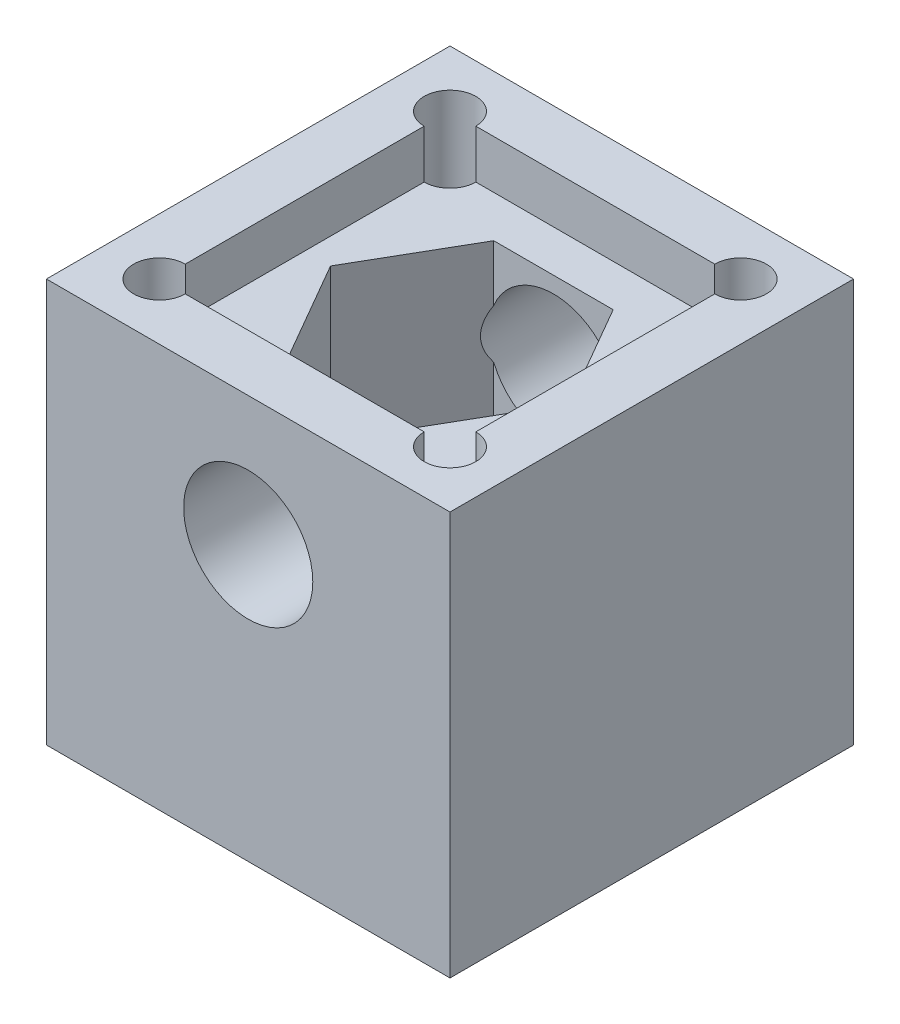
ISO-10303-21;
HEADER;
FILE_DESCRIPTION(('STEP AP214'),'2;1');
FILE_NAME('part.step','',(''),(''),'','','');
FILE_SCHEMA(('AUTOMOTIVE_DESIGN { 1 0 10303 214 1 1 1 1 }'));
ENDSEC;
DATA;
#1=APPLICATION_CONTEXT('core data for automotive mechanical design processes');
#2=APPLICATION_PROTOCOL_DEFINITION('international standard','automotive_design',2000,#1);
#3=PRODUCT_CONTEXT('',#1,'mechanical');
#4=PRODUCT('Part','Part','',(#3));
#5=PRODUCT_RELATED_PRODUCT_CATEGORY('part','',(#4));
#6=PRODUCT_DEFINITION_FORMATION('','',#4);
#7=PRODUCT_DEFINITION_CONTEXT('part definition',#1,'design');
#8=PRODUCT_DEFINITION('design','',#6,#7);
#9=PRODUCT_DEFINITION_SHAPE('','',#8);
#10=(LENGTH_UNIT() NAMED_UNIT(*) SI_UNIT(.MILLI.,.METRE.));
#11=(NAMED_UNIT(*) PLANE_ANGLE_UNIT() SI_UNIT($,.RADIAN.));
#12=(NAMED_UNIT(*) SI_UNIT($,.STERADIAN.) SOLID_ANGLE_UNIT());
#13=UNCERTAINTY_MEASURE_WITH_UNIT(LENGTH_MEASURE(1.E-05),#10,'distance_accuracy_value','');
#14=(GEOMETRIC_REPRESENTATION_CONTEXT(3) GLOBAL_UNCERTAINTY_ASSIGNED_CONTEXT((#13)) GLOBAL_UNIT_ASSIGNED_CONTEXT((#10,
#11,#12)) REPRESENTATION_CONTEXT('',''));
#15=CARTESIAN_POINT('',(0.,0.,0.));
#16=DIRECTION('',(0.,0.,1.));
#17=DIRECTION('',(1.,0.,0.));
#18=AXIS2_PLACEMENT_3D('',#15,#16,#17);
#19=CARTESIAN_POINT('',(-3.7,7.,-6.40858798800484));
#20=DIRECTION('',(-0.866025403784439,0.,-0.5));
#21=DIRECTION('',(-0.5,0.,0.866025403784439));
#22=AXIS2_PLACEMENT_3D('',#19,#20,#21);
#23=PLANE('',#22);
#24=DIRECTION('',(0.5,0.,-0.866025403784439));
#25=VECTOR('',#24,1.);
#26=CARTESIAN_POINT('',(-3.7,22.,-6.40858798800484));
#27=LINE('',#26,#25);
#28=CARTESIAN_POINT('',(-7.4,22.,0.));
#29=VERTEX_POINT('',#28);
#30=CARTESIAN_POINT('',(-3.7,22.,-6.40858798800484));
#31=VERTEX_POINT('',#30);
#32=EDGE_CURVE('E384',#29,#31,#27,.T.);
#33=ORIENTED_EDGE('',*,*,#32,.F.);
#34=DIRECTION('',(0.,1.,0.));
#35=VECTOR('',#34,1.);
#36=CARTESIAN_POINT('',(-7.4,7.,0.));
#37=LINE('',#36,#35);
#38=CARTESIAN_POINT('',(-7.4,7.,0.));
#39=VERTEX_POINT('',#38);
#40=EDGE_CURVE('E239',#39,#29,#37,.T.);
#41=ORIENTED_EDGE('',*,*,#40,.F.);
#42=DIRECTION('',(-0.5,0.,0.866025403784439));
#43=VECTOR('',#42,1.);
#44=CARTESIAN_POINT('',(-3.7,7.,-6.40858798800484));
#45=LINE('',#44,#43);
#46=CARTESIAN_POINT('',(-3.7,7.,-6.40858798800484));
#47=VERTEX_POINT('',#46);
#48=EDGE_CURVE('E235',#47,#39,#45,.T.);
#49=ORIENTED_EDGE('',*,*,#48,.F.);
#50=DIRECTION('',(0.,1.,0.));
#51=VECTOR('',#50,1.);
#52=CARTESIAN_POINT('',(-3.7,7.,-6.40858798800484));
#53=LINE('',#52,#51);
#54=CARTESIAN_POINT('',(-3.7,15.4801315846429,-6.40858798800484));
#55=VERTEX_POINT('',#54);
#56=EDGE_CURVE('E243',#47,#55,#53,.T.);
#57=ORIENTED_EDGE('',*,*,#56,.T.);
#58=CARTESIAN_POINT('',(0.,17.,-12.8171759760097));
#59=DIRECTION('',(-0.866025403784439,0.,-0.5));
#60=DIRECTION('',(-0.5,0.,0.866025403784439));
#61=AXIS2_PLACEMENT_3D('',#58,#59,#60);
#62=ELLIPSE('',#61,8.,4.);
#63=CARTESIAN_POINT('',(-3.7,18.5198684153571,-6.40858798800484));
#64=VERTEX_POINT('',#63);
#65=EDGE_CURVE('E268',#64,#55,#62,.F.);
#66=ORIENTED_EDGE('',*,*,#65,.F.);
#67=EDGE_CURVE('E246',#64,#31,#53,.T.);
#68=ORIENTED_EDGE('',*,*,#67,.T.);
#69=EDGE_LOOP('',(#33,#41,#49,#57,#66,#68));
#70=FACE_BOUND('',#69,.T.);
#71=ADVANCED_FACE('F34',(#70),#23,.F.);
#72=CARTESIAN_POINT('',(3.7,7.,-6.40858798800485));
#73=DIRECTION('',(0.,0.,-1.));
#74=DIRECTION('',(-1.,0.,0.));
#75=AXIS2_PLACEMENT_3D('',#72,#73,#74);
#76=PLANE('',#75);
#77=DIRECTION('',(1.,0.,0.));
#78=VECTOR('',#77,1.);
#79=CARTESIAN_POINT('',(3.7,22.,-6.40858798800485));
#80=LINE('',#79,#78);
#81=CARTESIAN_POINT('',(3.7,22.,-6.40858798800484));
#82=VERTEX_POINT('',#81);
#83=EDGE_CURVE('E382',#31,#82,#80,.T.);
#84=ORIENTED_EDGE('',*,*,#83,.F.);
#85=ORIENTED_EDGE('',*,*,#67,.F.);
#86=CARTESIAN_POINT('',(0.,17.,-6.40858798800485));
#87=DIRECTION('',(0.,0.,-1.));
#88=DIRECTION('',(-1.,0.,0.));
#89=AXIS2_PLACEMENT_3D('',#86,#87,#88);
#90=CIRCLE('',#89,4.);
#91=CARTESIAN_POINT('',(3.7,18.5198684153571,-6.40858798800485));
#92=VERTEX_POINT('',#91);
#93=EDGE_CURVE('E264',#92,#64,#90,.F.);
#94=ORIENTED_EDGE('',*,*,#93,.F.);
#95=DIRECTION('',(0.,1.,0.));
#96=VECTOR('',#95,1.);
#97=CARTESIAN_POINT('',(3.7,7.,-6.40858798800485));
#98=LINE('',#97,#96);
#99=EDGE_CURVE('E250',#92,#82,#98,.T.);
#100=ORIENTED_EDGE('',*,*,#99,.T.);
#101=EDGE_LOOP('',(#84,#85,#94,#100));
#102=FACE_BOUND('',#101,.T.);
#103=ADVANCED_FACE('F410',(#102),#76,.F.);
#104=CARTESIAN_POINT('',(7.4,7.,0.));
#105=DIRECTION('',(0.866025403784438,0.,-0.5));
#106=DIRECTION('',(-0.5,0.,-0.866025403784439));
#107=AXIS2_PLACEMENT_3D('',#104,#105,#106);
#108=PLANE('',#107);
#109=DIRECTION('',(0.5,0.,0.866025403784439));
#110=VECTOR('',#109,1.);
#111=CARTESIAN_POINT('',(7.4,22.,0.));
#112=LINE('',#111,#110);
#113=CARTESIAN_POINT('',(7.4,22.,0.));
#114=VERTEX_POINT('',#113);
#115=EDGE_CURVE('E380',#82,#114,#112,.T.);
#116=ORIENTED_EDGE('',*,*,#115,.F.);
#117=ORIENTED_EDGE('',*,*,#99,.F.);
#118=CARTESIAN_POINT('',(0.,17.,-12.8171759760097));
#119=DIRECTION('',(0.866025403784438,0.,-0.5));
#120=DIRECTION('',(0.5,0.,0.866025403784439));
#121=AXIS2_PLACEMENT_3D('',#118,#119,#120);
#122=ELLIPSE('',#121,8.,4.);
#123=CARTESIAN_POINT('',(3.7,15.4801315846429,-6.40858798800485));
#124=VERTEX_POINT('',#123);
#125=EDGE_CURVE('E261',#124,#92,#122,.F.);
#126=ORIENTED_EDGE('',*,*,#125,.F.);
#127=CARTESIAN_POINT('',(3.7,7.,-6.40858798800485));
#128=VERTEX_POINT('',#127);
#129=EDGE_CURVE('E247',#128,#124,#98,.T.);
#130=ORIENTED_EDGE('',*,*,#129,.F.);
#131=DIRECTION('',(-0.5,0.,-0.866025403784439));
#132=VECTOR('',#131,1.);
#133=CARTESIAN_POINT('',(7.4,7.,0.));
#134=LINE('',#133,#132);
#135=CARTESIAN_POINT('',(7.4,7.,0.));
#136=VERTEX_POINT('',#135);
#137=EDGE_CURVE('E229',#136,#128,#134,.T.);
#138=ORIENTED_EDGE('',*,*,#137,.F.);
#139=DIRECTION('',(0.,1.,0.));
#140=VECTOR('',#139,1.);
#141=CARTESIAN_POINT('',(7.4,7.,0.));
#142=LINE('',#141,#140);
#143=EDGE_CURVE('E251',#136,#114,#142,.T.);
#144=ORIENTED_EDGE('',*,*,#143,.T.);
#145=EDGE_LOOP('',(#116,#117,#126,#130,#138,#144));
#146=FACE_BOUND('',#145,.T.);
#147=ADVANCED_FACE('F416',(#146),#108,.F.);
#148=CARTESIAN_POINT('',(-7.4,7.,0.));
#149=DIRECTION('',(-0.866025403784438,0.,0.5));
#150=DIRECTION('',(0.5,0.,0.866025403784439));
#151=AXIS2_PLACEMENT_3D('',#148,#149,#150);
#152=PLANE('',#151);
#153=DIRECTION('',(-0.5,0.,-0.866025403784439));
#154=VECTOR('',#153,1.);
#155=CARTESIAN_POINT('',(-7.4,22.,0.));
#156=LINE('',#155,#154);
#157=CARTESIAN_POINT('',(-3.7,22.,6.40858798800485));
#158=VERTEX_POINT('',#157);
#159=EDGE_CURVE('E378',#158,#29,#156,.T.);
#160=ORIENTED_EDGE('',*,*,#159,.F.);
#161=DIRECTION('',(0.,1.,0.));
#162=VECTOR('',#161,1.);
#163=CARTESIAN_POINT('',(-3.7,7.,6.40858798800485));
#164=LINE('',#163,#162);
#165=CARTESIAN_POINT('',(-3.7,18.5198684153571,6.40858798800485));
#166=VERTEX_POINT('',#165);
#167=EDGE_CURVE('E238',#166,#158,#164,.T.);
#168=ORIENTED_EDGE('',*,*,#167,.F.);
#169=CARTESIAN_POINT('',(0.,17.,12.8171759760097));
#170=DIRECTION('',(-0.866025403784438,0.,0.5));
#171=DIRECTION('',(0.5,0.,0.866025403784439));
#172=AXIS2_PLACEMENT_3D('',#169,#170,#171);
#173=ELLIPSE('',#172,8.,4.);
#174=CARTESIAN_POINT('',(-3.7,15.4801315846429,6.40858798800485));
#175=VERTEX_POINT('',#174);
#176=EDGE_CURVE('E319',#175,#166,#173,.F.);
#177=ORIENTED_EDGE('',*,*,#176,.F.);
#178=CARTESIAN_POINT('',(-3.7,7.,6.40858798800485));
#179=VERTEX_POINT('',#178);
#180=EDGE_CURVE('E258',#179,#175,#164,.T.);
#181=ORIENTED_EDGE('',*,*,#180,.F.);
#182=DIRECTION('',(0.5,0.,0.866025403784439));
#183=VECTOR('',#182,1.);
#184=CARTESIAN_POINT('',(-7.4,7.,0.));
#185=LINE('',#184,#183);
#186=EDGE_CURVE('E214',#39,#179,#185,.T.);
#187=ORIENTED_EDGE('',*,*,#186,.F.);
#188=ORIENTED_EDGE('',*,*,#40,.T.);
#189=EDGE_LOOP('',(#160,#168,#177,#181,#187,#188));
#190=FACE_BOUND('',#189,.T.);
#191=ADVANCED_FACE('F431',(#190),#152,.F.);
#192=CARTESIAN_POINT('',(3.7,7.,6.40858798800485));
#193=DIRECTION('',(0.866025403784439,0.,0.5));
#194=DIRECTION('',(0.5,0.,-0.866025403784439));
#195=AXIS2_PLACEMENT_3D('',#192,#193,#194);
#196=PLANE('',#195);
#197=DIRECTION('',(-0.5,0.,0.866025403784439));
#198=VECTOR('',#197,1.);
#199=CARTESIAN_POINT('',(3.7,22.,6.40858798800485));
#200=LINE('',#199,#198);
#201=CARTESIAN_POINT('',(3.7,22.,6.40858798800485));
#202=VERTEX_POINT('',#201);
#203=EDGE_CURVE('E49',#114,#202,#200,.T.);
#204=ORIENTED_EDGE('',*,*,#203,.F.);
#205=ORIENTED_EDGE('',*,*,#143,.F.);
#206=DIRECTION('',(0.5,0.,-0.866025403784439));
#207=VECTOR('',#206,1.);
#208=CARTESIAN_POINT('',(3.7,7.,6.40858798800485));
#209=LINE('',#208,#207);
#210=CARTESIAN_POINT('',(3.7,7.,6.40858798800485));
#211=VERTEX_POINT('',#210);
#212=EDGE_CURVE('E226',#211,#136,#209,.T.);
#213=ORIENTED_EDGE('',*,*,#212,.F.);
#214=DIRECTION('',(0.,1.,0.));
#215=VECTOR('',#214,1.);
#216=CARTESIAN_POINT('',(3.7,7.,6.40858798800485));
#217=LINE('',#216,#215);
#218=CARTESIAN_POINT('',(3.7,15.4801315846429,6.40858798800485));
#219=VERTEX_POINT('',#218);
#220=EDGE_CURVE('E254',#211,#219,#217,.T.);
#221=ORIENTED_EDGE('',*,*,#220,.T.);
#222=CARTESIAN_POINT('',(0.,17.,12.8171759760097));
#223=DIRECTION('',(0.866025403784439,0.,0.5));
#224=DIRECTION('',(-0.5,0.,0.866025403784439));
#225=AXIS2_PLACEMENT_3D('',#222,#223,#224);
#226=ELLIPSE('',#225,8.00000000000001,4.);
#227=CARTESIAN_POINT('',(3.7,18.5198684153571,6.40858798800485));
#228=VERTEX_POINT('',#227);
#229=EDGE_CURVE('E315',#228,#219,#226,.F.);
#230=ORIENTED_EDGE('',*,*,#229,.F.);
#231=EDGE_CURVE('E257',#228,#202,#217,.T.);
#232=ORIENTED_EDGE('',*,*,#231,.T.);
#233=EDGE_LOOP('',(#204,#205,#213,#221,#230,#232));
#234=FACE_BOUND('',#233,.T.);
#235=ADVANCED_FACE('F433',(#234),#196,.F.);
#236=CARTESIAN_POINT('',(-3.7,7.,6.40858798800485));
#237=DIRECTION('',(0.,0.,1.));
#238=DIRECTION('',(1.,0.,0.));
#239=AXIS2_PLACEMENT_3D('',#236,#237,#238);
#240=PLANE('',#239);
#241=DIRECTION('',(-1.,0.,0.));
#242=VECTOR('',#241,1.);
#243=CARTESIAN_POINT('',(-3.7,22.,6.40858798800485));
#244=LINE('',#243,#242);
#245=EDGE_CURVE('E375',#202,#158,#244,.T.);
#246=ORIENTED_EDGE('',*,*,#245,.F.);
#247=ORIENTED_EDGE('',*,*,#231,.F.);
#248=CARTESIAN_POINT('',(0.,17.,6.40858798800485));
#249=DIRECTION('',(0.,0.,1.));
#250=DIRECTION('',(1.,0.,0.));
#251=AXIS2_PLACEMENT_3D('',#248,#249,#250);
#252=CIRCLE('',#251,4.);
#253=EDGE_CURVE('E310',#166,#228,#252,.F.);
#254=ORIENTED_EDGE('',*,*,#253,.F.);
#255=ORIENTED_EDGE('',*,*,#167,.T.);
#256=EDGE_LOOP('',(#246,#247,#254,#255));
#257=FACE_BOUND('',#256,.T.);
#258=ADVANCED_FACE('F436',(#257),#240,.F.);
#259=CARTESIAN_POINT('',(0.,0.,0.));
#260=DIRECTION('',(0.,1.,0.));
#261=DIRECTION('',(0.,0.,1.));
#262=AXIS2_PLACEMENT_3D('',#259,#260,#261);
#263=CYLINDRICAL_SURFACE('',#262,4.15);
#264=CARTESIAN_POINT('',(0.,0.,0.));
#265=DIRECTION('',(0.,1.,0.));
#266=DIRECTION('',(0.,0.,1.));
#267=AXIS2_PLACEMENT_3D('',#264,#265,#266);
#268=CIRCLE('',#267,4.15);
#269=CARTESIAN_POINT('',(0.,0.,4.15));
#270=VERTEX_POINT('',#269);
#271=EDGE_CURVE('E271',#270,#270,#268,.T.);
#272=ORIENTED_EDGE('',*,*,#271,.F.);
#273=EDGE_LOOP('',(#272));
#274=FACE_BOUND('',#273,.T.);
#275=CARTESIAN_POINT('',(0.,7.,0.));
#276=DIRECTION('',(0.,1.,0.));
#277=DIRECTION('',(0.,0.,1.));
#278=AXIS2_PLACEMENT_3D('',#275,#276,#277);
#279=CIRCLE('',#278,4.15);
#280=CARTESIAN_POINT('',(0.,7.,4.15));
#281=VERTEX_POINT('',#280);
#282=EDGE_CURVE('E242',#281,#281,#279,.F.);
#283=ORIENTED_EDGE('',*,*,#282,.F.);
#284=EDGE_LOOP('',(#283));
#285=FACE_BOUND('',#284,.T.);
#286=ADVANCED_FACE('F444',(#274,#285),#263,.F.);
#287=CARTESIAN_POINT('',(0.,17.,-12.5));
#288=DIRECTION('',(0.,0.,1.));
#289=DIRECTION('',(1.,0.,0.));
#290=AXIS2_PLACEMENT_3D('',#287,#288,#289);
#291=CYLINDRICAL_SURFACE('',#290,4.);
#292=ORIENTED_EDGE('',*,*,#93,.T.);
#293=ORIENTED_EDGE('',*,*,#65,.T.);
#294=EDGE_CURVE('E267',#55,#124,#90,.F.);
#295=ORIENTED_EDGE('',*,*,#294,.T.);
#296=ORIENTED_EDGE('',*,*,#125,.T.);
#297=EDGE_LOOP('',(#292,#293,#295,#296));
#298=FACE_BOUND('',#297,.T.);
#299=CARTESIAN_POINT('',(0.,17.,-12.5));
#300=DIRECTION('',(0.,0.,1.));
#301=DIRECTION('',(1.,0.,0.));
#302=AXIS2_PLACEMENT_3D('',#299,#300,#301);
#303=CIRCLE('',#302,4.);
#304=CARTESIAN_POINT('',(4.,17.,-12.5));
#305=VERTEX_POINT('',#304);
#306=EDGE_CURVE('E275',#305,#305,#303,.T.);
#307=ORIENTED_EDGE('',*,*,#306,.F.);
#308=EDGE_LOOP('',(#307));
#309=FACE_BOUND('',#308,.T.);
#310=ADVANCED_FACE('F447',(#298,#309),#291,.F.);
#311=CARTESIAN_POINT('',(-12.5,25.,12.5));
#312=DIRECTION('',(1.,0.,0.));
#313=DIRECTION('',(0.,0.,-1.));
#314=AXIS2_PLACEMENT_3D('',#311,#312,#313);
#315=PLANE('',#314);
#316=DIRECTION('',(0.,0.,1.));
#317=VECTOR('',#316,1.);
#318=CARTESIAN_POINT('',(-12.5,0.,12.5));
#319=LINE('',#318,#317);
#320=CARTESIAN_POINT('',(-12.5,0.,-12.5));
#321=VERTEX_POINT('',#320);
#322=CARTESIAN_POINT('',(-12.5,0.,12.5));
#323=VERTEX_POINT('',#322);
#324=EDGE_CURVE('E278',#321,#323,#319,.T.);
#325=ORIENTED_EDGE('',*,*,#324,.T.);
#326=DIRECTION('',(0.,-1.,0.));
#327=VECTOR('',#326,1.);
#328=CARTESIAN_POINT('',(-12.5,25.,12.5));
#329=LINE('',#328,#327);
#330=CARTESIAN_POINT('',(-12.5,25.,12.5));
#331=VERTEX_POINT('',#330);
#332=EDGE_CURVE('E307',#331,#323,#329,.T.);
#333=ORIENTED_EDGE('',*,*,#332,.F.);
#334=DIRECTION('',(0.,0.,1.));
#335=VECTOR('',#334,1.);
#336=CARTESIAN_POINT('',(-12.5,25.,12.5));
#337=LINE('',#336,#335);
#338=CARTESIAN_POINT('',(-12.5,25.,-12.5));
#339=VERTEX_POINT('',#338);
#340=EDGE_CURVE('E281',#339,#331,#337,.T.);
#341=ORIENTED_EDGE('',*,*,#340,.F.);
#342=DIRECTION('',(0.,-1.,0.));
#343=VECTOR('',#342,1.);
#344=CARTESIAN_POINT('',(-12.5,25.,-12.5));
#345=LINE('',#344,#343);
#346=EDGE_CURVE('E291',#339,#321,#345,.T.);
#347=ORIENTED_EDGE('',*,*,#346,.T.);
#348=EDGE_LOOP('',(#325,#333,#341,#347));
#349=FACE_BOUND('',#348,.T.);
#350=ADVANCED_FACE('F36',(#349),#315,.F.);
#351=CARTESIAN_POINT('',(12.5,25.,12.5));
#352=DIRECTION('',(0.,0.,-1.));
#353=DIRECTION('',(-1.,0.,0.));
#354=AXIS2_PLACEMENT_3D('',#351,#352,#353);
#355=PLANE('',#354);
#356=CARTESIAN_POINT('',(0.,17.,12.5));
#357=DIRECTION('',(0.,0.,1.));
#358=DIRECTION('',(1.,0.,0.));
#359=AXIS2_PLACEMENT_3D('',#356,#357,#358);
#360=CIRCLE('',#359,4.);
#361=CARTESIAN_POINT('',(4.,17.,12.5));
#362=VERTEX_POINT('',#361);
#363=EDGE_CURVE('E274',#362,#362,#360,.T.);
#364=ORIENTED_EDGE('',*,*,#363,.F.);
#365=EDGE_LOOP('',(#364));
#366=FACE_BOUND('',#365,.T.);
#367=DIRECTION('',(1.,0.,0.));
#368=VECTOR('',#367,1.);
#369=CARTESIAN_POINT('',(12.5,0.,12.5));
#370=LINE('',#369,#368);
#371=CARTESIAN_POINT('',(12.5,0.,12.5));
#372=VERTEX_POINT('',#371);
#373=EDGE_CURVE('E294',#323,#372,#370,.T.);
#374=ORIENTED_EDGE('',*,*,#373,.T.);
#375=DIRECTION('',(0.,-1.,0.));
#376=VECTOR('',#375,1.);
#377=CARTESIAN_POINT('',(12.5,25.,12.5));
#378=LINE('',#377,#376);
#379=CARTESIAN_POINT('',(12.5,25.,12.5));
#380=VERTEX_POINT('',#379);
#381=EDGE_CURVE('E304',#380,#372,#378,.T.);
#382=ORIENTED_EDGE('',*,*,#381,.F.);
#383=DIRECTION('',(1.,0.,0.));
#384=VECTOR('',#383,1.);
#385=CARTESIAN_POINT('',(12.5,25.,12.5));
#386=LINE('',#385,#384);
#387=EDGE_CURVE('E284',#331,#380,#386,.T.);
#388=ORIENTED_EDGE('',*,*,#387,.F.);
#389=ORIENTED_EDGE('',*,*,#332,.T.);
#390=EDGE_LOOP('',(#374,#382,#388,#389));
#391=FACE_BOUND('',#390,.T.);
#392=ADVANCED_FACE('F464',(#366,#391),#355,.F.);
#393=CARTESIAN_POINT('',(12.5,25.,12.5));
#394=DIRECTION('',(-1.,0.,0.));
#395=DIRECTION('',(0.,0.,1.));
#396=AXIS2_PLACEMENT_3D('',#393,#394,#395);
#397=PLANE('',#396);
#398=DIRECTION('',(0.,0.,-1.));
#399=VECTOR('',#398,1.);
#400=CARTESIAN_POINT('',(12.5,0.,12.5));
#401=LINE('',#400,#399);
#402=CARTESIAN_POINT('',(12.5,0.,-12.5));
#403=VERTEX_POINT('',#402);
#404=EDGE_CURVE('E296',#372,#403,#401,.T.);
#405=ORIENTED_EDGE('',*,*,#404,.T.);
#406=DIRECTION('',(0.,-1.,0.));
#407=VECTOR('',#406,1.);
#408=CARTESIAN_POINT('',(12.5,25.,-12.5));
#409=LINE('',#408,#407);
#410=CARTESIAN_POINT('',(12.5,25.,-12.5));
#411=VERTEX_POINT('',#410);
#412=EDGE_CURVE('E301',#411,#403,#409,.T.);
#413=ORIENTED_EDGE('',*,*,#412,.F.);
#414=DIRECTION('',(0.,0.,-1.));
#415=VECTOR('',#414,1.);
#416=CARTESIAN_POINT('',(12.5,25.,12.5));
#417=LINE('',#416,#415);
#418=EDGE_CURVE('E287',#380,#411,#417,.T.);
#419=ORIENTED_EDGE('',*,*,#418,.F.);
#420=ORIENTED_EDGE('',*,*,#381,.T.);
#421=EDGE_LOOP('',(#405,#413,#419,#420));
#422=FACE_BOUND('',#421,.T.);
#423=ADVANCED_FACE('F461',(#422),#397,.F.);
#424=CARTESIAN_POINT('',(12.5,25.,-12.5));
#425=DIRECTION('',(0.,0.,1.));
#426=DIRECTION('',(1.,0.,0.));
#427=AXIS2_PLACEMENT_3D('',#424,#425,#426);
#428=PLANE('',#427);
#429=ORIENTED_EDGE('',*,*,#306,.T.);
#430=EDGE_LOOP('',(#429));
#431=FACE_BOUND('',#430,.T.);
#432=DIRECTION('',(-1.,0.,0.));
#433=VECTOR('',#432,1.);
#434=CARTESIAN_POINT('',(12.5,0.,-12.5));
#435=LINE('',#434,#433);
#436=EDGE_CURVE('E285',#403,#321,#435,.T.);
#437=ORIENTED_EDGE('',*,*,#436,.T.);
#438=ORIENTED_EDGE('',*,*,#346,.F.);
#439=DIRECTION('',(-1.,0.,0.));
#440=VECTOR('',#439,1.);
#441=CARTESIAN_POINT('',(12.5,25.,-12.5));
#442=LINE('',#441,#440);
#443=EDGE_CURVE('E289',#411,#339,#442,.T.);
#444=ORIENTED_EDGE('',*,*,#443,.F.);
#445=ORIENTED_EDGE('',*,*,#412,.T.);
#446=EDGE_LOOP('',(#437,#438,#444,#445));
#447=FACE_BOUND('',#446,.T.);
#448=ADVANCED_FACE('F455',(#431,#447),#428,.F.);
#449=CARTESIAN_POINT('',(0.,25.,0.));
#450=DIRECTION('',(0.,1.,0.));
#451=DIRECTION('',(0.,0.,1.));
#452=AXIS2_PLACEMENT_3D('',#449,#450,#451);
#453=PLANE('',#452);
#454=DIRECTION('',(0.,0.,-1.));
#455=VECTOR('',#454,1.);
#456=CARTESIAN_POINT('',(9.,25.,-9.));
#457=LINE('',#456,#455);
#458=CARTESIAN_POINT('',(9.,25.,7.4));
#459=VERTEX_POINT('',#458);
#460=CARTESIAN_POINT('',(9.,25.,-7.4));
#461=VERTEX_POINT('',#460);
#462=EDGE_CURVE('E186',#459,#461,#457,.T.);
#463=ORIENTED_EDGE('',*,*,#462,.F.);
#464=CARTESIAN_POINT('',(9.,25.,9.));
#465=DIRECTION('',(0.,1.,0.));
#466=DIRECTION('',(0.,0.,1.));
#467=AXIS2_PLACEMENT_3D('',#464,#465,#466);
#468=CIRCLE('',#467,1.6);
#469=CARTESIAN_POINT('',(7.4,25.,9.));
#470=VERTEX_POINT('',#469);
#471=EDGE_CURVE('E201',#470,#459,#468,.T.);
#472=ORIENTED_EDGE('',*,*,#471,.F.);
#473=DIRECTION('',(1.,0.,0.));
#474=VECTOR('',#473,1.);
#475=CARTESIAN_POINT('',(-9.,25.,9.));
#476=LINE('',#475,#474);
#477=CARTESIAN_POINT('',(-7.4,25.,9.));
#478=VERTEX_POINT('',#477);
#479=EDGE_CURVE('E362',#478,#470,#476,.T.);
#480=ORIENTED_EDGE('',*,*,#479,.F.);
#481=CARTESIAN_POINT('',(-9.,25.,9.));
#482=DIRECTION('',(0.,1.,0.));
#483=DIRECTION('',(0.,0.,1.));
#484=AXIS2_PLACEMENT_3D('',#481,#482,#483);
#485=CIRCLE('',#484,1.6);
#486=CARTESIAN_POINT('',(-9.,25.,7.4));
#487=VERTEX_POINT('',#486);
#488=EDGE_CURVE('E217',#487,#478,#485,.T.);
#489=ORIENTED_EDGE('',*,*,#488,.F.);
#490=DIRECTION('',(0.,0.,1.));
#491=VECTOR('',#490,1.);
#492=CARTESIAN_POINT('',(-9.,25.,-9.));
#493=LINE('',#492,#491);
#494=CARTESIAN_POINT('',(-9.,25.,-7.4));
#495=VERTEX_POINT('',#494);
#496=EDGE_CURVE('E344',#495,#487,#493,.T.);
#497=ORIENTED_EDGE('',*,*,#496,.F.);
#498=CARTESIAN_POINT('',(-9.,25.,-9.));
#499=DIRECTION('',(0.,1.,0.));
#500=DIRECTION('',(0.,0.,1.));
#501=AXIS2_PLACEMENT_3D('',#498,#499,#500);
#502=CIRCLE('',#501,1.6);
#503=CARTESIAN_POINT('',(-7.4,25.,-9.));
#504=VERTEX_POINT('',#503);
#505=EDGE_CURVE('E337',#504,#495,#502,.T.);
#506=ORIENTED_EDGE('',*,*,#505,.F.);
#507=DIRECTION('',(-1.,0.,0.));
#508=VECTOR('',#507,1.);
#509=CARTESIAN_POINT('',(-9.,25.,-9.));
#510=LINE('',#509,#508);
#511=CARTESIAN_POINT('',(7.4,25.,-9.));
#512=VERTEX_POINT('',#511);
#513=EDGE_CURVE('E204',#512,#504,#510,.T.);
#514=ORIENTED_EDGE('',*,*,#513,.F.);
#515=CARTESIAN_POINT('',(9.,25.,-9.));
#516=DIRECTION('',(0.,1.,0.));
#517=DIRECTION('',(0.,0.,1.));
#518=AXIS2_PLACEMENT_3D('',#515,#516,#517);
#519=CIRCLE('',#518,1.6);
#520=EDGE_CURVE('E192',#461,#512,#519,.T.);
#521=ORIENTED_EDGE('',*,*,#520,.F.);
#522=EDGE_LOOP('',(#463,#472,#480,#489,#497,#506,#514,#521));
#523=FACE_BOUND('',#522,.T.);
#524=ORIENTED_EDGE('',*,*,#340,.T.);
#525=ORIENTED_EDGE('',*,*,#387,.T.);
#526=ORIENTED_EDGE('',*,*,#418,.T.);
#527=ORIENTED_EDGE('',*,*,#443,.T.);
#528=EDGE_LOOP('',(#524,#525,#526,#527));
#529=FACE_BOUND('',#528,.T.);
#530=ADVANCED_FACE('F198',(#523,#529),#453,.T.);
#531=CARTESIAN_POINT('',(0.,0.,0.));
#532=DIRECTION('',(0.,1.,0.));
#533=DIRECTION('',(0.,0.,1.));
#534=AXIS2_PLACEMENT_3D('',#531,#532,#533);
#535=PLANE('',#534);
#536=CARTESIAN_POINT('',(-9.,0.,9.));
#537=DIRECTION('',(0.,1.,0.));
#538=DIRECTION('',(0.,0.,1.));
#539=AXIS2_PLACEMENT_3D('',#536,#537,#538);
#540=CIRCLE('',#539,1.6);
#541=CARTESIAN_POINT('',(-9.,0.,10.6));
#542=VERTEX_POINT('',#541);
#543=EDGE_CURVE('E211',#542,#542,#540,.T.);
#544=ORIENTED_EDGE('',*,*,#543,.T.);
#545=EDGE_LOOP('',(#544));
#546=FACE_BOUND('',#545,.T.);
#547=CARTESIAN_POINT('',(-9.,0.,-9.));
#548=DIRECTION('',(0.,1.,0.));
#549=DIRECTION('',(0.,0.,1.));
#550=AXIS2_PLACEMENT_3D('',#547,#548,#549);
#551=CIRCLE('',#550,1.6);
#552=CARTESIAN_POINT('',(-9.,0.,-7.4));
#553=VERTEX_POINT('',#552);
#554=EDGE_CURVE('E345',#553,#553,#551,.T.);
#555=ORIENTED_EDGE('',*,*,#554,.T.);
#556=EDGE_LOOP('',(#555));
#557=FACE_BOUND('',#556,.T.);
#558=CARTESIAN_POINT('',(9.,0.,-9.));
#559=DIRECTION('',(0.,1.,0.));
#560=DIRECTION('',(0.,0.,1.));
#561=AXIS2_PLACEMENT_3D('',#558,#559,#560);
#562=CIRCLE('',#561,1.6);
#563=CARTESIAN_POINT('',(9.,0.,-7.4));
#564=VERTEX_POINT('',#563);
#565=EDGE_CURVE('E346',#564,#564,#562,.T.);
#566=ORIENTED_EDGE('',*,*,#565,.T.);
#567=EDGE_LOOP('',(#566));
#568=FACE_BOUND('',#567,.T.);
#569=CARTESIAN_POINT('',(9.,0.,9.));
#570=DIRECTION('',(0.,1.,0.));
#571=DIRECTION('',(0.,0.,1.));
#572=AXIS2_PLACEMENT_3D('',#569,#570,#571);
#573=CIRCLE('',#572,1.6);
#574=CARTESIAN_POINT('',(9.,0.,10.6));
#575=VERTEX_POINT('',#574);
#576=EDGE_CURVE('E210',#575,#575,#573,.T.);
#577=ORIENTED_EDGE('',*,*,#576,.T.);
#578=EDGE_LOOP('',(#577));
#579=FACE_BOUND('',#578,.T.);
#580=ORIENTED_EDGE('',*,*,#271,.T.);
#581=EDGE_LOOP('',(#580));
#582=FACE_BOUND('',#581,.T.);
#583=ORIENTED_EDGE('',*,*,#324,.F.);
#584=ORIENTED_EDGE('',*,*,#436,.F.);
#585=ORIENTED_EDGE('',*,*,#404,.F.);
#586=ORIENTED_EDGE('',*,*,#373,.F.);
#587=EDGE_LOOP('',(#583,#584,#585,#586));
#588=FACE_BOUND('',#587,.T.);
#589=ADVANCED_FACE('F451',(#546,#557,#568,#579,#582,#588),#535,.F.);
#590=ORIENTED_EDGE('',*,*,#229,.T.);
#591=EDGE_CURVE('E316',#219,#175,#252,.F.);
#592=ORIENTED_EDGE('',*,*,#591,.T.);
#593=ORIENTED_EDGE('',*,*,#176,.T.);
#594=ORIENTED_EDGE('',*,*,#253,.T.);
#595=EDGE_LOOP('',(#590,#592,#593,#594));
#596=FACE_BOUND('',#595,.T.);
#597=ORIENTED_EDGE('',*,*,#363,.T.);
#598=EDGE_LOOP('',(#597));
#599=FACE_BOUND('',#598,.T.);
#600=ADVANCED_FACE('F427',(#596,#599),#291,.F.);
#601=ORIENTED_EDGE('',*,*,#56,.F.);
#602=DIRECTION('',(-1.,0.,0.));
#603=VECTOR('',#602,1.);
#604=CARTESIAN_POINT('',(3.7,7.,-6.40858798800485));
#605=LINE('',#604,#603);
#606=EDGE_CURVE('E232',#128,#47,#605,.T.);
#607=ORIENTED_EDGE('',*,*,#606,.F.);
#608=ORIENTED_EDGE('',*,*,#129,.T.);
#609=ORIENTED_EDGE('',*,*,#294,.F.);
#610=EDGE_LOOP('',(#601,#607,#608,#609));
#611=FACE_BOUND('',#610,.T.);
#612=ADVANCED_FACE('F419',(#611),#76,.F.);
#613=ORIENTED_EDGE('',*,*,#220,.F.);
#614=DIRECTION('',(1.,0.,0.));
#615=VECTOR('',#614,1.);
#616=CARTESIAN_POINT('',(-3.7,7.,6.40858798800485));
#617=LINE('',#616,#615);
#618=EDGE_CURVE('E223',#179,#211,#617,.T.);
#619=ORIENTED_EDGE('',*,*,#618,.F.);
#620=ORIENTED_EDGE('',*,*,#180,.T.);
#621=ORIENTED_EDGE('',*,*,#591,.F.);
#622=EDGE_LOOP('',(#613,#619,#620,#621));
#623=FACE_BOUND('',#622,.T.);
#624=ADVANCED_FACE('F426',(#623),#240,.F.);
#625=CARTESIAN_POINT('',(0.,7.,0.));
#626=DIRECTION('',(0.,1.,0.));
#627=DIRECTION('',(0.,0.,1.));
#628=AXIS2_PLACEMENT_3D('',#625,#626,#627);
#629=PLANE('',#628);
#630=ORIENTED_EDGE('',*,*,#186,.T.);
#631=ORIENTED_EDGE('',*,*,#618,.T.);
#632=ORIENTED_EDGE('',*,*,#212,.T.);
#633=ORIENTED_EDGE('',*,*,#137,.T.);
#634=ORIENTED_EDGE('',*,*,#606,.T.);
#635=ORIENTED_EDGE('',*,*,#48,.T.);
#636=EDGE_LOOP('',(#630,#631,#632,#633,#634,#635));
#637=FACE_BOUND('',#636,.T.);
#638=ORIENTED_EDGE('',*,*,#282,.T.);
#639=EDGE_LOOP('',(#638));
#640=FACE_BOUND('',#639,.T.);
#641=ADVANCED_FACE('F422',(#637,#640),#629,.T.);
#642=CARTESIAN_POINT('',(9.,0.,9.));
#643=DIRECTION('',(0.,1.,0.));
#644=DIRECTION('',(0.,0.,1.));
#645=AXIS2_PLACEMENT_3D('',#642,#643,#644);
#646=CYLINDRICAL_SURFACE('',#645,1.6);
#647=ORIENTED_EDGE('',*,*,#471,.T.);
#648=DIRECTION('',(0.,1.,0.));
#649=VECTOR('',#648,1.);
#650=CARTESIAN_POINT('',(9.,0.,7.4));
#651=LINE('',#650,#649);
#652=CARTESIAN_POINT('',(9.,22.,7.4));
#653=VERTEX_POINT('',#652);
#654=EDGE_CURVE('E183',#459,#653,#651,.F.);
#655=ORIENTED_EDGE('',*,*,#654,.T.);
#656=CARTESIAN_POINT('',(9.,22.,9.));
#657=DIRECTION('',(0.,1.,0.));
#658=DIRECTION('',(0.,0.,1.));
#659=AXIS2_PLACEMENT_3D('',#656,#657,#658);
#660=CIRCLE('',#659,1.6);
#661=CARTESIAN_POINT('',(7.4,22.,9.));
#662=VERTEX_POINT('',#661);
#663=EDGE_CURVE('E360',#662,#653,#660,.F.);
#664=ORIENTED_EDGE('',*,*,#663,.F.);
#665=DIRECTION('',(0.,1.,0.));
#666=VECTOR('',#665,1.);
#667=CARTESIAN_POINT('',(7.4,0.,9.));
#668=LINE('',#667,#666);
#669=EDGE_CURVE('E209',#662,#470,#668,.T.);
#670=ORIENTED_EDGE('',*,*,#669,.T.);
#671=EDGE_LOOP('',(#647,#655,#664,#670));
#672=FACE_BOUND('',#671,.T.);
#673=ORIENTED_EDGE('',*,*,#576,.F.);
#674=EDGE_LOOP('',(#673));
#675=FACE_BOUND('',#674,.T.);
#676=ADVANCED_FACE('F207',(#672,#675),#646,.F.);
#677=CARTESIAN_POINT('',(9.,0.,-9.));
#678=DIRECTION('',(0.,1.,0.));
#679=DIRECTION('',(0.,0.,1.));
#680=AXIS2_PLACEMENT_3D('',#677,#678,#679);
#681=CYLINDRICAL_SURFACE('',#680,1.6);
#682=ORIENTED_EDGE('',*,*,#565,.F.);
#683=EDGE_LOOP('',(#682));
#684=FACE_BOUND('',#683,.T.);
#685=CARTESIAN_POINT('',(9.,22.,-9.));
#686=DIRECTION('',(0.,1.,0.));
#687=DIRECTION('',(0.,0.,1.));
#688=AXIS2_PLACEMENT_3D('',#685,#686,#687);
#689=CIRCLE('',#688,1.6);
#690=CARTESIAN_POINT('',(9.,22.,-7.4));
#691=VERTEX_POINT('',#690);
#692=CARTESIAN_POINT('',(7.4,22.,-9.));
#693=VERTEX_POINT('',#692);
#694=EDGE_CURVE('E357',#691,#693,#689,.F.);
#695=ORIENTED_EDGE('',*,*,#694,.F.);
#696=DIRECTION('',(0.,1.,0.));
#697=VECTOR('',#696,1.);
#698=CARTESIAN_POINT('',(9.,0.,-7.4));
#699=LINE('',#698,#697);
#700=EDGE_CURVE('E11',#691,#461,#699,.T.);
#701=ORIENTED_EDGE('',*,*,#700,.T.);
#702=ORIENTED_EDGE('',*,*,#520,.T.);
#703=DIRECTION('',(0.,1.,0.));
#704=VECTOR('',#703,1.);
#705=CARTESIAN_POINT('',(7.4,0.,-9.));
#706=LINE('',#705,#704);
#707=EDGE_CURVE('E193',#512,#693,#706,.F.);
#708=ORIENTED_EDGE('',*,*,#707,.T.);
#709=EDGE_LOOP('',(#695,#701,#702,#708));
#710=FACE_BOUND('',#709,.T.);
#711=ADVANCED_FACE('F356',(#684,#710),#681,.F.);
#712=CARTESIAN_POINT('',(-9.,0.,-9.));
#713=DIRECTION('',(0.,1.,0.));
#714=DIRECTION('',(0.,0.,1.));
#715=AXIS2_PLACEMENT_3D('',#712,#713,#714);
#716=CYLINDRICAL_SURFACE('',#715,1.6);
#717=ORIENTED_EDGE('',*,*,#505,.T.);
#718=DIRECTION('',(0.,1.,0.));
#719=VECTOR('',#718,1.);
#720=CARTESIAN_POINT('',(-9.,0.,-7.4));
#721=LINE('',#720,#719);
#722=CARTESIAN_POINT('',(-9.,22.,-7.4));
#723=VERTEX_POINT('',#722);
#724=EDGE_CURVE('E386',#495,#723,#721,.F.);
#725=ORIENTED_EDGE('',*,*,#724,.T.);
#726=CARTESIAN_POINT('',(-9.,22.,-9.));
#727=DIRECTION('',(0.,1.,0.));
#728=DIRECTION('',(0.,0.,1.));
#729=AXIS2_PLACEMENT_3D('',#726,#727,#728);
#730=CIRCLE('',#729,1.6);
#731=CARTESIAN_POINT('',(-7.4,22.,-9.));
#732=VERTEX_POINT('',#731);
#733=EDGE_CURVE('E338',#732,#723,#730,.F.);
#734=ORIENTED_EDGE('',*,*,#733,.F.);
#735=DIRECTION('',(0.,1.,0.));
#736=VECTOR('',#735,1.);
#737=CARTESIAN_POINT('',(-7.4,0.,-9.));
#738=LINE('',#737,#736);
#739=EDGE_CURVE('E42',#732,#504,#738,.T.);
#740=ORIENTED_EDGE('',*,*,#739,.T.);
#741=EDGE_LOOP('',(#717,#725,#734,#740));
#742=FACE_BOUND('',#741,.T.);
#743=ORIENTED_EDGE('',*,*,#554,.F.);
#744=EDGE_LOOP('',(#743));
#745=FACE_BOUND('',#744,.T.);
#746=ADVANCED_FACE('F334',(#742,#745),#716,.F.);
#747=CARTESIAN_POINT('',(-9.,0.,9.));
#748=DIRECTION('',(0.,1.,0.));
#749=DIRECTION('',(0.,0.,1.));
#750=AXIS2_PLACEMENT_3D('',#747,#748,#749);
#751=CYLINDRICAL_SURFACE('',#750,1.6);
#752=ORIENTED_EDGE('',*,*,#488,.T.);
#753=DIRECTION('',(0.,1.,0.));
#754=VECTOR('',#753,1.);
#755=CARTESIAN_POINT('',(-7.4,0.,9.));
#756=LINE('',#755,#754);
#757=CARTESIAN_POINT('',(-7.4,22.,9.));
#758=VERTEX_POINT('',#757);
#759=EDGE_CURVE('E327',#478,#758,#756,.F.);
#760=ORIENTED_EDGE('',*,*,#759,.T.);
#761=CARTESIAN_POINT('',(-9.,22.,9.));
#762=DIRECTION('',(0.,1.,0.));
#763=DIRECTION('',(0.,0.,1.));
#764=AXIS2_PLACEMENT_3D('',#761,#762,#763);
#765=CIRCLE('',#764,1.6);
#766=CARTESIAN_POINT('',(-9.,22.,7.4));
#767=VERTEX_POINT('',#766);
#768=EDGE_CURVE('E322',#767,#758,#765,.F.);
#769=ORIENTED_EDGE('',*,*,#768,.F.);
#770=DIRECTION('',(0.,1.,0.));
#771=VECTOR('',#770,1.);
#772=CARTESIAN_POINT('',(-9.,0.,7.4));
#773=LINE('',#772,#771);
#774=EDGE_CURVE('E324',#767,#487,#773,.T.);
#775=ORIENTED_EDGE('',*,*,#774,.T.);
#776=EDGE_LOOP('',(#752,#760,#769,#775));
#777=FACE_BOUND('',#776,.T.);
#778=ORIENTED_EDGE('',*,*,#543,.F.);
#779=EDGE_LOOP('',(#778));
#780=FACE_BOUND('',#779,.T.);
#781=ADVANCED_FACE('F391',(#777,#780),#751,.F.);
#782=CARTESIAN_POINT('',(9.,22.,-9.));
#783=DIRECTION('',(1.,0.,0.));
#784=DIRECTION('',(0.,0.,-1.));
#785=AXIS2_PLACEMENT_3D('',#782,#783,#784);
#786=PLANE('',#785);
#787=ORIENTED_EDGE('',*,*,#462,.T.);
#788=ORIENTED_EDGE('',*,*,#700,.F.);
#789=DIRECTION('',(0.,0.,-1.));
#790=VECTOR('',#789,1.);
#791=CARTESIAN_POINT('',(9.,22.,-9.));
#792=LINE('',#791,#790);
#793=EDGE_CURVE('E188',#653,#691,#792,.T.);
#794=ORIENTED_EDGE('',*,*,#793,.F.);
#795=ORIENTED_EDGE('',*,*,#654,.F.);
#796=EDGE_LOOP('',(#787,#788,#794,#795));
#797=FACE_BOUND('',#796,.T.);
#798=ADVANCED_FACE('F185',(#797),#786,.F.);
#799=CARTESIAN_POINT('',(-9.,22.,-9.));
#800=DIRECTION('',(0.,0.,-1.));
#801=DIRECTION('',(-1.,0.,0.));
#802=AXIS2_PLACEMENT_3D('',#799,#800,#801);
#803=PLANE('',#802);
#804=ORIENTED_EDGE('',*,*,#513,.T.);
#805=ORIENTED_EDGE('',*,*,#739,.F.);
#806=DIRECTION('',(-1.,0.,0.));
#807=VECTOR('',#806,1.);
#808=CARTESIAN_POINT('',(-9.,22.,-9.));
#809=LINE('',#808,#807);
#810=EDGE_CURVE('E361',#693,#732,#809,.T.);
#811=ORIENTED_EDGE('',*,*,#810,.F.);
#812=ORIENTED_EDGE('',*,*,#707,.F.);
#813=EDGE_LOOP('',(#804,#805,#811,#812));
#814=FACE_BOUND('',#813,.T.);
#815=ADVANCED_FACE('F399',(#814),#803,.F.);
#816=CARTESIAN_POINT('',(-9.,22.,9.));
#817=DIRECTION('',(0.,0.,1.));
#818=DIRECTION('',(1.,0.,0.));
#819=AXIS2_PLACEMENT_3D('',#816,#817,#818);
#820=PLANE('',#819);
#821=DIRECTION('',(1.,0.,0.));
#822=VECTOR('',#821,1.);
#823=CARTESIAN_POINT('',(-9.,22.,9.));
#824=LINE('',#823,#822);
#825=EDGE_CURVE('E368',#758,#662,#824,.T.);
#826=ORIENTED_EDGE('',*,*,#825,.F.);
#827=ORIENTED_EDGE('',*,*,#759,.F.);
#828=ORIENTED_EDGE('',*,*,#479,.T.);
#829=ORIENTED_EDGE('',*,*,#669,.F.);
#830=EDGE_LOOP('',(#826,#827,#828,#829));
#831=FACE_BOUND('',#830,.T.);
#832=ADVANCED_FACE('F396',(#831),#820,.F.);
#833=CARTESIAN_POINT('',(-9.,22.,-9.));
#834=DIRECTION('',(-1.,0.,0.));
#835=DIRECTION('',(0.,0.,1.));
#836=AXIS2_PLACEMENT_3D('',#833,#834,#835);
#837=PLANE('',#836);
#838=ORIENTED_EDGE('',*,*,#496,.T.);
#839=ORIENTED_EDGE('',*,*,#774,.F.);
#840=DIRECTION('',(0.,0.,1.));
#841=VECTOR('',#840,1.);
#842=CARTESIAN_POINT('',(-9.,22.,-9.));
#843=LINE('',#842,#841);
#844=EDGE_CURVE('E57',#723,#767,#843,.T.);
#845=ORIENTED_EDGE('',*,*,#844,.F.);
#846=ORIENTED_EDGE('',*,*,#724,.F.);
#847=EDGE_LOOP('',(#838,#839,#845,#846));
#848=FACE_BOUND('',#847,.T.);
#849=ADVANCED_FACE('F398',(#848),#837,.F.);
#850=CARTESIAN_POINT('',(0.,22.,0.));
#851=DIRECTION('',(0.,1.,0.));
#852=DIRECTION('',(0.,0.,1.));
#853=AXIS2_PLACEMENT_3D('',#850,#851,#852);
#854=PLANE('',#853);
#855=ORIENTED_EDGE('',*,*,#663,.T.);
#856=ORIENTED_EDGE('',*,*,#793,.T.);
#857=ORIENTED_EDGE('',*,*,#694,.T.);
#858=ORIENTED_EDGE('',*,*,#810,.T.);
#859=ORIENTED_EDGE('',*,*,#733,.T.);
#860=ORIENTED_EDGE('',*,*,#844,.T.);
#861=ORIENTED_EDGE('',*,*,#768,.T.);
#862=ORIENTED_EDGE('',*,*,#825,.T.);
#863=EDGE_LOOP('',(#855,#856,#857,#858,#859,#860,#861,#862));
#864=FACE_BOUND('',#863,.T.);
#865=ORIENTED_EDGE('',*,*,#32,.T.);
#866=ORIENTED_EDGE('',*,*,#83,.T.);
#867=ORIENTED_EDGE('',*,*,#115,.T.);
#868=ORIENTED_EDGE('',*,*,#203,.T.);
#869=ORIENTED_EDGE('',*,*,#245,.T.);
#870=ORIENTED_EDGE('',*,*,#159,.T.);
#871=EDGE_LOOP('',(#865,#866,#867,#868,#869,#870));
#872=FACE_BOUND('',#871,.T.);
#873=ADVANCED_FACE('F358',(#864,#872),#854,.T.);
#874=CLOSED_SHELL('',(#71,#103,#147,#191,#235,#258,#286,#310,#350,#392,#423,#448,#530,#589,#600,
#612,#624,#641,#676,#711,#746,#781,#798,#815,#832,#849,#873));
#875=MANIFOLD_SOLID_BREP('B2',#874);
#876=ADVANCED_BREP_SHAPE_REPRESENTATION('',(#18,#875),#14);
#877=SHAPE_DEFINITION_REPRESENTATION(#9,#876);
ENDSEC;
END-ISO-10303-21;
